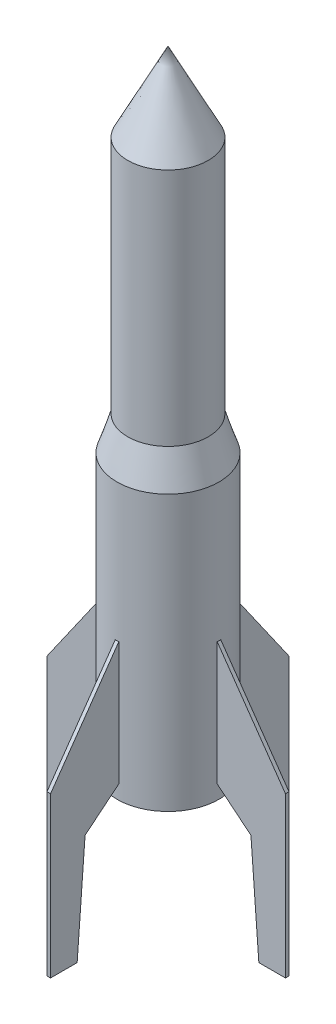
ISO-10303-21;
HEADER;
FILE_DESCRIPTION(('STEP AP214'),'2;1');
FILE_NAME('part.step','',(''),(''),'','','');
FILE_SCHEMA(('AUTOMOTIVE_DESIGN { 1 0 10303 214 1 1 1 1 }'));
ENDSEC;
DATA;
#1=APPLICATION_CONTEXT('core data for automotive mechanical design processes');
#2=APPLICATION_PROTOCOL_DEFINITION('international standard','automotive_design',2000,#1);
#3=PRODUCT_CONTEXT('',#1,'mechanical');
#4=PRODUCT('Part','Part','',(#3));
#5=PRODUCT_RELATED_PRODUCT_CATEGORY('part','',(#4));
#6=PRODUCT_DEFINITION_FORMATION('','',#4);
#7=PRODUCT_DEFINITION_CONTEXT('part definition',#1,'design');
#8=PRODUCT_DEFINITION('design','',#6,#7);
#9=PRODUCT_DEFINITION_SHAPE('','',#8);
#10=(LENGTH_UNIT() NAMED_UNIT(*) SI_UNIT(.MILLI.,.METRE.));
#11=(NAMED_UNIT(*) PLANE_ANGLE_UNIT() SI_UNIT($,.RADIAN.));
#12=(NAMED_UNIT(*) SI_UNIT($,.STERADIAN.) SOLID_ANGLE_UNIT());
#13=UNCERTAINTY_MEASURE_WITH_UNIT(LENGTH_MEASURE(1.E-05),#10,'distance_accuracy_value','');
#14=(GEOMETRIC_REPRESENTATION_CONTEXT(3) GLOBAL_UNCERTAINTY_ASSIGNED_CONTEXT((#13)) GLOBAL_UNIT_ASSIGNED_CONTEXT((#10,
#11,#12)) REPRESENTATION_CONTEXT('',''));
#15=CARTESIAN_POINT('',(0.,0.,0.));
#16=DIRECTION('',(0.,0.,1.));
#17=DIRECTION('',(1.,0.,0.));
#18=AXIS2_PLACEMENT_3D('',#15,#16,#17);
#19=CARTESIAN_POINT('',(-1.99999999999859,-135.,134.5));
#20=DIRECTION('',(0.,1.,0.));
#21=DIRECTION('',(-1.,0.,0.));
#22=AXIS2_PLACEMENT_3D('',#19,#20,#21);
#23=PLANE('',#22);
#24=DIRECTION('',(0.,0.,-1.));
#25=VECTOR('',#24,1.);
#26=CARTESIAN_POINT('',(-1.99999999999859,-135.,134.5));
#27=LINE('',#26,#25);
#28=CARTESIAN_POINT('',(-1.99999999999859,-135.,134.5));
#29=VERTEX_POINT('',#28);
#30=CARTESIAN_POINT('',(-1.99999999999892,-135.,104.5));
#31=VERTEX_POINT('',#30);
#32=EDGE_CURVE('E141',#29,#31,#27,.T.);
#33=ORIENTED_EDGE('',*,*,#32,.T.);
#34=DIRECTION('',(1.,0.,0.));
#35=VECTOR('',#34,1.);
#36=CARTESIAN_POINT('',(-74.9999999999989,-135.,104.500000000001));
#37=LINE('',#36,#35);
#38=CARTESIAN_POINT('',(2.00000000000109,-135.,104.5));
#39=VERTEX_POINT('',#38);
#40=EDGE_CURVE('E95',#31,#39,#37,.T.);
#41=ORIENTED_EDGE('',*,*,#40,.T.);
#42=DIRECTION('',(0.,0.,-1.));
#43=VECTOR('',#42,1.);
#44=CARTESIAN_POINT('',(2.00000000000141,-135.,134.5));
#45=LINE('',#44,#43);
#46=CARTESIAN_POINT('',(2.00000000000141,-135.,134.5));
#47=VERTEX_POINT('',#46);
#48=EDGE_CURVE('E120',#47,#39,#45,.T.);
#49=ORIENTED_EDGE('',*,*,#48,.F.);
#50=DIRECTION('',(1.,0.,0.));
#51=VECTOR('',#50,1.);
#52=CARTESIAN_POINT('',(-1.99999999999859,-135.,134.5));
#53=LINE('',#52,#51);
#54=EDGE_CURVE('E140',#29,#47,#53,.T.);
#55=ORIENTED_EDGE('',*,*,#54,.F.);
#56=EDGE_LOOP('',(#33,#41,#49,#55));
#57=FACE_BOUND('',#56,.T.);
#58=ADVANCED_FACE('F52',(#57),#23,.F.);
#59=CARTESIAN_POINT('',(2.00000000000141,-135.,134.5));
#60=DIRECTION('',(-1.,0.,0.));
#61=DIRECTION('',(0.,-1.,0.));
#62=AXIS2_PLACEMENT_3D('',#59,#60,#61);
#63=PLANE('',#62);
#64=ORIENTED_EDGE('',*,*,#48,.T.);
#65=DIRECTION('',(0.,-0.997211296292099,0.0746299574395645));
#66=VECTOR('',#65,1.);
#67=CARTESIAN_POINT('',(2.00000000000109,-135.,104.5));
#68=LINE('',#67,#66);
#69=CARTESIAN_POINT('',(2.00000000000099,-15.,95.5193607653192));
#70=VERTEX_POINT('',#69);
#71=EDGE_CURVE('E126',#70,#39,#68,.T.);
#72=ORIENTED_EDGE('',*,*,#71,.F.);
#73=DIRECTION('',(0.,-0.633341672383861,0.773872293096228));
#74=VECTOR('',#73,1.);
#75=CARTESIAN_POINT('',(2.00000000000099,-15.,95.5193607653192));
#76=LINE('',#75,#74);
#77=CARTESIAN_POINT('',(2.00000000000059,16.1152702388822,57.5));
#78=VERTEX_POINT('',#77);
#79=EDGE_CURVE('E114',#78,#70,#76,.T.);
#80=ORIENTED_EDGE('',*,*,#79,.F.);
#81=DIRECTION('',(0.,1.,0.));
#82=VECTOR('',#81,1.);
#83=CARTESIAN_POINT('',(2.0000000000006,-135.,57.5));
#84=LINE('',#83,#82);
#85=CARTESIAN_POINT('',(2.00000000000058,155.,57.5));
#86=VERTEX_POINT('',#85);
#87=EDGE_CURVE('E124',#78,#86,#84,.T.);
#88=ORIENTED_EDGE('',*,*,#87,.T.);
#89=DIRECTION('',(0.,0.81923192051904,-0.573462344363328));
#90=VECTOR('',#89,1.);
#91=CARTESIAN_POINT('',(2.0000000000014,45.,134.5));
#92=LINE('',#91,#90);
#93=CARTESIAN_POINT('',(2.0000000000014,45.,134.5));
#94=VERTEX_POINT('',#93);
#95=EDGE_CURVE('E87',#94,#86,#92,.T.);
#96=ORIENTED_EDGE('',*,*,#95,.F.);
#97=DIRECTION('',(0.,1.,0.));
#98=VECTOR('',#97,1.);
#99=CARTESIAN_POINT('',(2.00000000000141,-135.,134.5));
#100=LINE('',#99,#98);
#101=EDGE_CURVE('E146',#47,#94,#100,.T.);
#102=ORIENTED_EDGE('',*,*,#101,.F.);
#103=EDGE_LOOP('',(#64,#72,#80,#88,#96,#102));
#104=FACE_BOUND('',#103,.T.);
#105=ADVANCED_FACE('F123',(#104),#63,.F.);
#106=CARTESIAN_POINT('',(-1.99999999999868,155.,134.5));
#107=DIRECTION('',(1.,0.,0.));
#108=DIRECTION('',(0.,1.,0.));
#109=AXIS2_PLACEMENT_3D('',#106,#107,#108);
#110=PLANE('',#109);
#111=DIRECTION('',(0.,-0.633341672383861,0.773872293096228));
#112=VECTOR('',#111,1.);
#113=CARTESIAN_POINT('',(-1.99999999999968,34.0852764619174,35.5426734428662));
#114=LINE('',#113,#112);
#115=CARTESIAN_POINT('',(-1.99999999999944,16.1152702388822,57.5));
#116=VERTEX_POINT('',#115);
#117=CARTESIAN_POINT('',(-1.99999999999904,-15.,95.5193607653192));
#118=VERTEX_POINT('',#117);
#119=EDGE_CURVE('E66',#116,#118,#114,.T.);
#120=ORIENTED_EDGE('',*,*,#119,.T.);
#121=DIRECTION('',(0.,-0.997211296292099,0.0746299574395645));
#122=VECTOR('',#121,1.);
#123=CARTESIAN_POINT('',(-1.99999999999922,151.152152043229,83.0847563022686));
#124=LINE('',#123,#122);
#125=EDGE_CURVE('E12',#118,#31,#124,.T.);
#126=ORIENTED_EDGE('',*,*,#125,.T.);
#127=ORIENTED_EDGE('',*,*,#32,.F.);
#128=DIRECTION('',(0.,-1.,0.));
#129=VECTOR('',#128,1.);
#130=CARTESIAN_POINT('',(-1.99999999999868,155.,134.5));
#131=LINE('',#130,#129);
#132=CARTESIAN_POINT('',(-1.99999999999868,45.,134.5));
#133=VERTEX_POINT('',#132);
#134=EDGE_CURVE('E75',#133,#29,#131,.T.);
#135=ORIENTED_EDGE('',*,*,#134,.F.);
#136=DIRECTION('',(0.,0.81923192051904,-0.573462344363328));
#137=VECTOR('',#136,1.);
#138=CARTESIAN_POINT('',(-1.99999999999921,118.825503355705,82.8221476510068));
#139=LINE('',#138,#137);
#140=CARTESIAN_POINT('',(-1.99999999999948,155.,57.5));
#141=VERTEX_POINT('',#140);
#142=EDGE_CURVE('E134',#133,#141,#139,.T.);
#143=ORIENTED_EDGE('',*,*,#142,.T.);
#144=DIRECTION('',(0.,-1.,0.));
#145=VECTOR('',#144,1.);
#146=CARTESIAN_POINT('',(-1.99999999999949,155.,57.5));
#147=LINE('',#146,#145);
#148=EDGE_CURVE('E132',#141,#116,#147,.T.);
#149=ORIENTED_EDGE('',*,*,#148,.T.);
#150=EDGE_LOOP('',(#120,#126,#127,#135,#143,#149));
#151=FACE_BOUND('',#150,.T.);
#152=ADVANCED_FACE('F160',(#151),#110,.F.);
#153=CARTESIAN_POINT('',(1.4088127202232E-12,0.,134.5));
#154=DIRECTION('',(0.,0.,1.));
#155=DIRECTION('',(1.,0.,0.));
#156=AXIS2_PLACEMENT_3D('',#153,#154,#155);
#157=PLANE('',#156);
#158=DIRECTION('',(1.,0.,0.));
#159=VECTOR('',#158,1.);
#160=CARTESIAN_POINT('',(-74.9999999999986,45.,134.500000000001));
#161=LINE('',#160,#159);
#162=EDGE_CURVE('E127',#133,#94,#161,.T.);
#163=ORIENTED_EDGE('',*,*,#162,.F.);
#164=ORIENTED_EDGE('',*,*,#134,.T.);
#165=ORIENTED_EDGE('',*,*,#54,.T.);
#166=ORIENTED_EDGE('',*,*,#101,.T.);
#167=EDGE_LOOP('',(#163,#164,#165,#166));
#168=FACE_BOUND('',#167,.T.);
#169=ADVANCED_FACE('F158',(#168),#157,.T.);
#170=CARTESIAN_POINT('',(6.0228053095044E-13,0.,57.5));
#171=DIRECTION('',(0.,0.,1.));
#172=DIRECTION('',(1.,0.,0.));
#173=AXIS2_PLACEMENT_3D('',#170,#171,#172);
#174=PLANE('',#173);
#175=ORIENTED_EDGE('',*,*,#87,.F.);
#176=DIRECTION('',(-1.,0.,0.));
#177=VECTOR('',#176,1.);
#178=CARTESIAN_POINT('',(6.01316546895092E-13,16.1152702388822,57.5));
#179=LINE('',#178,#177);
#180=EDGE_CURVE('E59',#78,#116,#179,.T.);
#181=ORIENTED_EDGE('',*,*,#180,.T.);
#182=ORIENTED_EDGE('',*,*,#148,.F.);
#183=DIRECTION('',(-1.,0.,0.));
#184=VECTOR('',#183,1.);
#185=CARTESIAN_POINT('',(2.00000000000058,155.,57.5));
#186=LINE('',#185,#184);
#187=EDGE_CURVE('E130',#86,#141,#186,.T.);
#188=ORIENTED_EDGE('',*,*,#187,.F.);
#189=EDGE_LOOP('',(#175,#181,#182,#188));
#190=FACE_BOUND('',#189,.T.);
#191=ADVANCED_FACE('F129',(#190),#174,.F.);
#192=CARTESIAN_POINT('',(-74.9999999999986,45.,134.500000000001));
#193=DIRECTION('',(0.,-0.573462344363328,-0.81923192051904));
#194=DIRECTION('',(0.,-0.81923192051904,0.573462344363328));
#195=AXIS2_PLACEMENT_3D('',#192,#193,#194);
#196=PLANE('',#195);
#197=ORIENTED_EDGE('',*,*,#162,.T.);
#198=ORIENTED_EDGE('',*,*,#95,.T.);
#199=ORIENTED_EDGE('',*,*,#187,.T.);
#200=ORIENTED_EDGE('',*,*,#142,.F.);
#201=EDGE_LOOP('',(#197,#198,#199,#200));
#202=FACE_BOUND('',#201,.T.);
#203=ADVANCED_FACE('F163',(#202),#196,.F.);
#204=CARTESIAN_POINT('',(-74.9999999999989,-135.,104.500000000001));
#205=DIRECTION('',(0.,0.0746299574395645,0.997211296292099));
#206=DIRECTION('',(0.,0.997211296292099,-0.0746299574395645));
#207=AXIS2_PLACEMENT_3D('',#204,#205,#206);
#208=PLANE('',#207);
#209=DIRECTION('',(1.,0.,0.));
#210=VECTOR('',#209,1.);
#211=CARTESIAN_POINT('',(-74.999999999999,-15.,95.51936076532));
#212=LINE('',#211,#210);
#213=EDGE_CURVE('E149',#118,#70,#212,.T.);
#214=ORIENTED_EDGE('',*,*,#213,.T.);
#215=ORIENTED_EDGE('',*,*,#71,.T.);
#216=ORIENTED_EDGE('',*,*,#40,.F.);
#217=ORIENTED_EDGE('',*,*,#125,.F.);
#218=EDGE_LOOP('',(#214,#215,#216,#217));
#219=FACE_BOUND('',#218,.T.);
#220=ADVANCED_FACE('F161',(#219),#208,.F.);
#221=CARTESIAN_POINT('',(-74.999999999999,-15.,95.51936076532));
#222=DIRECTION('',(0.,0.773872293096228,0.633341672383861));
#223=DIRECTION('',(0.,0.633341672383861,-0.773872293096228));
#224=AXIS2_PLACEMENT_3D('',#221,#222,#223);
#225=PLANE('',#224);
#226=ORIENTED_EDGE('',*,*,#180,.F.);
#227=ORIENTED_EDGE('',*,*,#79,.T.);
#228=ORIENTED_EDGE('',*,*,#213,.F.);
#229=ORIENTED_EDGE('',*,*,#119,.F.);
#230=EDGE_LOOP('',(#226,#227,#228,#229));
#231=FACE_BOUND('',#230,.T.);
#232=ADVANCED_FACE('F113',(#231),#225,.F.);
#233=CLOSED_SHELL('',(#58,#105,#152,#169,#191,#203,#220,#232));
#234=MANIFOLD_SOLID_BREP('B2',#233);
#235=CARTESIAN_POINT('',(-134.5,-135.,-2.));
#236=DIRECTION('',(0.,1.,0.));
#237=DIRECTION('',(0.,0.,-1.));
#238=AXIS2_PLACEMENT_3D('',#235,#236,#237);
#239=PLANE('',#238);
#240=DIRECTION('',(1.,0.,0.));
#241=VECTOR('',#240,1.);
#242=CARTESIAN_POINT('',(-134.5,-135.,-2.));
#243=LINE('',#242,#241);
#244=CARTESIAN_POINT('',(-134.5,-135.,-2.));
#245=VERTEX_POINT('',#244);
#246=CARTESIAN_POINT('',(-104.5,-135.,-2.00000000000002));
#247=VERTEX_POINT('',#246);
#248=EDGE_CURVE('E339',#245,#247,#243,.T.);
#249=ORIENTED_EDGE('',*,*,#248,.T.);
#250=DIRECTION('',(0.,0.,1.));
#251=VECTOR('',#250,1.);
#252=CARTESIAN_POINT('',(-104.5,-135.,-75.));
#253=LINE('',#252,#251);
#254=CARTESIAN_POINT('',(-104.5,-135.,2.));
#255=VERTEX_POINT('',#254);
#256=EDGE_CURVE('E293',#247,#255,#253,.T.);
#257=ORIENTED_EDGE('',*,*,#256,.T.);
#258=DIRECTION('',(1.,0.,0.));
#259=VECTOR('',#258,1.);
#260=CARTESIAN_POINT('',(-134.5,-135.,2.));
#261=LINE('',#260,#259);
#262=CARTESIAN_POINT('',(-134.5,-135.,2.));
#263=VERTEX_POINT('',#262);
#264=EDGE_CURVE('E318',#263,#255,#261,.T.);
#265=ORIENTED_EDGE('',*,*,#264,.F.);
#266=DIRECTION('',(0.,0.,1.));
#267=VECTOR('',#266,1.);
#268=CARTESIAN_POINT('',(-134.5,-135.,-2.));
#269=LINE('',#268,#267);
#270=EDGE_CURVE('E338',#245,#263,#269,.T.);
#271=ORIENTED_EDGE('',*,*,#270,.F.);
#272=EDGE_LOOP('',(#249,#257,#265,#271));
#273=FACE_BOUND('',#272,.T.);
#274=ADVANCED_FACE('F250',(#273),#239,.F.);
#275=CARTESIAN_POINT('',(-134.5,-135.,2.));
#276=DIRECTION('',(0.,0.,-1.));
#277=DIRECTION('',(0.,-1.,0.));
#278=AXIS2_PLACEMENT_3D('',#275,#276,#277);
#279=PLANE('',#278);
#280=ORIENTED_EDGE('',*,*,#264,.T.);
#281=DIRECTION('',(-0.0746299574395645,-0.997211296292099,0.));
#282=VECTOR('',#281,1.);
#283=CARTESIAN_POINT('',(-104.5,-135.,2.));
#284=LINE('',#283,#282);
#285=CARTESIAN_POINT('',(-95.5193607653192,-15.,1.99999999999999));
#286=VERTEX_POINT('',#285);
#287=EDGE_CURVE('E324',#286,#255,#284,.T.);
#288=ORIENTED_EDGE('',*,*,#287,.F.);
#289=DIRECTION('',(-0.773872293096228,-0.633341672383861,0.));
#290=VECTOR('',#289,1.);
#291=CARTESIAN_POINT('',(-95.5193607653192,-15.,1.99999999999999));
#292=LINE('',#291,#290);
#293=CARTESIAN_POINT('',(-57.5,16.1152702388822,1.99999999999999));
#294=VERTEX_POINT('',#293);
#295=EDGE_CURVE('E312',#294,#286,#292,.T.);
#296=ORIENTED_EDGE('',*,*,#295,.F.);
#297=DIRECTION('',(0.,1.,0.));
#298=VECTOR('',#297,1.);
#299=CARTESIAN_POINT('',(-57.5,-135.,2.));
#300=LINE('',#299,#298);
#301=CARTESIAN_POINT('',(-57.5,155.,1.99999999999998));
#302=VERTEX_POINT('',#301);
#303=EDGE_CURVE('E322',#294,#302,#300,.T.);
#304=ORIENTED_EDGE('',*,*,#303,.T.);
#305=DIRECTION('',(0.573462344363328,0.81923192051904,0.));
#306=VECTOR('',#305,1.);
#307=CARTESIAN_POINT('',(-134.5,45.,1.99999999999999));
#308=LINE('',#307,#306);
#309=CARTESIAN_POINT('',(-134.5,45.,1.99999999999999));
#310=VERTEX_POINT('',#309);
#311=EDGE_CURVE('E285',#310,#302,#308,.T.);
#312=ORIENTED_EDGE('',*,*,#311,.F.);
#313=DIRECTION('',(0.,1.,0.));
#314=VECTOR('',#313,1.);
#315=CARTESIAN_POINT('',(-134.5,-135.,2.));
#316=LINE('',#315,#314);
#317=EDGE_CURVE('E344',#263,#310,#316,.T.);
#318=ORIENTED_EDGE('',*,*,#317,.F.);
#319=EDGE_LOOP('',(#280,#288,#296,#304,#312,#318));
#320=FACE_BOUND('',#319,.T.);
#321=ADVANCED_FACE('F321',(#320),#279,.F.);
#322=CARTESIAN_POINT('',(-134.5,155.,-2.00000000000009));
#323=DIRECTION('',(0.,0.,1.));
#324=DIRECTION('',(0.,1.,0.));
#325=AXIS2_PLACEMENT_3D('',#322,#323,#324);
#326=PLANE('',#325);
#327=DIRECTION('',(-0.773872293096228,-0.633341672383861,0.));
#328=VECTOR('',#327,1.);
#329=CARTESIAN_POINT('',(-35.5426734428661,34.0852764619174,-2.00000000000005));
#330=LINE('',#329,#328);
#331=CARTESIAN_POINT('',(-57.5,16.1152702388822,-2.00000000000005));
#332=VERTEX_POINT('',#331);
#333=CARTESIAN_POINT('',(-95.5193607653192,-15.,-2.00000000000004));
#334=VERTEX_POINT('',#333);
#335=EDGE_CURVE('E264',#332,#334,#330,.T.);
#336=ORIENTED_EDGE('',*,*,#335,.T.);
#337=DIRECTION('',(-0.0746299574395645,-0.997211296292099,0.));
#338=VECTOR('',#337,1.);
#339=CARTESIAN_POINT('',(-83.0847563022686,151.152152043229,-2.00000000000009));
#340=LINE('',#339,#338);
#341=EDGE_CURVE('E50',#334,#247,#340,.T.);
#342=ORIENTED_EDGE('',*,*,#341,.T.);
#343=ORIENTED_EDGE('',*,*,#248,.F.);
#344=DIRECTION('',(0.,-1.,0.));
#345=VECTOR('',#344,1.);
#346=CARTESIAN_POINT('',(-134.5,155.,-2.00000000000009));
#347=LINE('',#346,#345);
#348=CARTESIAN_POINT('',(-134.5,45.,-2.00000000000009));
#349=VERTEX_POINT('',#348);
#350=EDGE_CURVE('E273',#349,#245,#347,.T.);
#351=ORIENTED_EDGE('',*,*,#350,.F.);
#352=DIRECTION('',(0.573462344363328,0.81923192051904,0.));
#353=VECTOR('',#352,1.);
#354=CARTESIAN_POINT('',(-82.8221476510067,118.825503355705,-2.00000000000008));
#355=LINE('',#354,#353);
#356=CARTESIAN_POINT('',(-57.5,155.,-2.00000000000009));
#357=VERTEX_POINT('',#356);
#358=EDGE_CURVE('E332',#349,#357,#355,.T.);
#359=ORIENTED_EDGE('',*,*,#358,.T.);
#360=DIRECTION('',(0.,-1.,0.));
#361=VECTOR('',#360,1.);
#362=CARTESIAN_POINT('',(-57.5,155.,-2.00000000000009));
#363=LINE('',#362,#361);
#364=EDGE_CURVE('E330',#357,#332,#363,.T.);
#365=ORIENTED_EDGE('',*,*,#364,.T.);
#366=EDGE_LOOP('',(#336,#342,#343,#351,#359,#365));
#367=FACE_BOUND('',#366,.T.);
#368=ADVANCED_FACE('F358',(#367),#326,.F.);
#369=CARTESIAN_POINT('',(-134.5,0.,0.));
#370=DIRECTION('',(-1.,0.,0.));
#371=DIRECTION('',(0.,0.,1.));
#372=AXIS2_PLACEMENT_3D('',#369,#370,#371);
#373=PLANE('',#372);
#374=DIRECTION('',(0.,0.,1.));
#375=VECTOR('',#374,1.);
#376=CARTESIAN_POINT('',(-134.5,45.,-75.));
#377=LINE('',#376,#375);
#378=EDGE_CURVE('E325',#349,#310,#377,.T.);
#379=ORIENTED_EDGE('',*,*,#378,.F.);
#380=ORIENTED_EDGE('',*,*,#350,.T.);
#381=ORIENTED_EDGE('',*,*,#270,.T.);
#382=ORIENTED_EDGE('',*,*,#317,.T.);
#383=EDGE_LOOP('',(#379,#380,#381,#382));
#384=FACE_BOUND('',#383,.T.);
#385=ADVANCED_FACE('F356',(#384),#373,.T.);
#386=CARTESIAN_POINT('',(-57.5,0.,0.));
#387=DIRECTION('',(-1.,0.,0.));
#388=DIRECTION('',(0.,0.,1.));
#389=AXIS2_PLACEMENT_3D('',#386,#387,#388);
#390=PLANE('',#389);
#391=ORIENTED_EDGE('',*,*,#303,.F.);
#392=DIRECTION('',(0.,0.,-1.));
#393=VECTOR('',#392,1.);
#394=CARTESIAN_POINT('',(-57.5,16.1152702388822,0.));
#395=LINE('',#394,#393);
#396=EDGE_CURVE('E257',#294,#332,#395,.T.);
#397=ORIENTED_EDGE('',*,*,#396,.T.);
#398=ORIENTED_EDGE('',*,*,#364,.F.);
#399=DIRECTION('',(0.,0.,-1.));
#400=VECTOR('',#399,1.);
#401=CARTESIAN_POINT('',(-57.5,155.,1.99999999999998));
#402=LINE('',#401,#400);
#403=EDGE_CURVE('E328',#302,#357,#402,.T.);
#404=ORIENTED_EDGE('',*,*,#403,.F.);
#405=EDGE_LOOP('',(#391,#397,#398,#404));
#406=FACE_BOUND('',#405,.T.);
#407=ADVANCED_FACE('F327',(#406),#390,.F.);
#408=CARTESIAN_POINT('',(-134.5,45.,-75.));
#409=DIRECTION('',(0.81923192051904,-0.573462344363328,0.));
#410=DIRECTION('',(-0.573462344363328,-0.81923192051904,0.));
#411=AXIS2_PLACEMENT_3D('',#408,#409,#410);
#412=PLANE('',#411);
#413=ORIENTED_EDGE('',*,*,#378,.T.);
#414=ORIENTED_EDGE('',*,*,#311,.T.);
#415=ORIENTED_EDGE('',*,*,#403,.T.);
#416=ORIENTED_EDGE('',*,*,#358,.F.);
#417=EDGE_LOOP('',(#413,#414,#415,#416));
#418=FACE_BOUND('',#417,.T.);
#419=ADVANCED_FACE('F361',(#418),#412,.F.);
#420=CARTESIAN_POINT('',(-104.5,-135.,-75.));
#421=DIRECTION('',(-0.997211296292099,0.0746299574395645,0.));
#422=DIRECTION('',(0.0746299574395645,0.997211296292099,0.));
#423=AXIS2_PLACEMENT_3D('',#420,#421,#422);
#424=PLANE('',#423);
#425=DIRECTION('',(0.,0.,1.));
#426=VECTOR('',#425,1.);
#427=CARTESIAN_POINT('',(-95.5193607653192,-15.,-75.));
#428=LINE('',#427,#426);
#429=EDGE_CURVE('E347',#334,#286,#428,.T.);
#430=ORIENTED_EDGE('',*,*,#429,.T.);
#431=ORIENTED_EDGE('',*,*,#287,.T.);
#432=ORIENTED_EDGE('',*,*,#256,.F.);
#433=ORIENTED_EDGE('',*,*,#341,.F.);
#434=EDGE_LOOP('',(#430,#431,#432,#433));
#435=FACE_BOUND('',#434,.T.);
#436=ADVANCED_FACE('F359',(#435),#424,.F.);
#437=CARTESIAN_POINT('',(-95.5193607653192,-15.,-75.));
#438=DIRECTION('',(-0.633341672383861,0.773872293096228,0.));
#439=DIRECTION('',(0.773872293096228,0.633341672383861,0.));
#440=AXIS2_PLACEMENT_3D('',#437,#438,#439);
#441=PLANE('',#440);
#442=ORIENTED_EDGE('',*,*,#396,.F.);
#443=ORIENTED_EDGE('',*,*,#295,.T.);
#444=ORIENTED_EDGE('',*,*,#429,.F.);
#445=ORIENTED_EDGE('',*,*,#335,.F.);
#446=EDGE_LOOP('',(#442,#443,#444,#445));
#447=FACE_BOUND('',#446,.T.);
#448=ADVANCED_FACE('F311',(#447),#441,.F.);
#449=CLOSED_SHELL('',(#274,#321,#368,#385,#407,#419,#436,#448));
#450=MANIFOLD_SOLID_BREP('B6',#449);
#451=CARTESIAN_POINT('',(1.99999999999953,-135.,-134.5));
#452=DIRECTION('',(0.,1.,0.));
#453=DIRECTION('',(1.,0.,0.));
#454=AXIS2_PLACEMENT_3D('',#451,#452,#453);
#455=PLANE('',#454);
#456=DIRECTION('',(0.,0.,1.));
#457=VECTOR('',#456,1.);
#458=CARTESIAN_POINT('',(1.99999999999953,-135.,-134.5));
#459=LINE('',#458,#457);
#460=CARTESIAN_POINT('',(1.99999999999953,-135.,-134.5));
#461=VERTEX_POINT('',#460);
#462=CARTESIAN_POINT('',(1.99999999999965,-135.,-104.5));
#463=VERTEX_POINT('',#462);
#464=EDGE_CURVE('E537',#461,#463,#459,.T.);
#465=ORIENTED_EDGE('',*,*,#464,.T.);
#466=DIRECTION('',(-1.,0.,0.));
#467=VECTOR('',#466,1.);
#468=CARTESIAN_POINT('',(74.9999999999996,-135.,-104.5));
#469=LINE('',#468,#467);
#470=CARTESIAN_POINT('',(-2.00000000000036,-135.,-104.5));
#471=VERTEX_POINT('',#470);
#472=EDGE_CURVE('E491',#463,#471,#469,.T.);
#473=ORIENTED_EDGE('',*,*,#472,.T.);
#474=DIRECTION('',(0.,0.,1.));
#475=VECTOR('',#474,1.);
#476=CARTESIAN_POINT('',(-2.00000000000047,-135.,-134.5));
#477=LINE('',#476,#475);
#478=CARTESIAN_POINT('',(-2.00000000000047,-135.,-134.5));
#479=VERTEX_POINT('',#478);
#480=EDGE_CURVE('E516',#479,#471,#477,.T.);
#481=ORIENTED_EDGE('',*,*,#480,.F.);
#482=DIRECTION('',(-1.,0.,0.));
#483=VECTOR('',#482,1.);
#484=CARTESIAN_POINT('',(1.99999999999953,-135.,-134.5));
#485=LINE('',#484,#483);
#486=EDGE_CURVE('E536',#461,#479,#485,.T.);
#487=ORIENTED_EDGE('',*,*,#486,.F.);
#488=EDGE_LOOP('',(#465,#473,#481,#487));
#489=FACE_BOUND('',#488,.T.);
#490=ADVANCED_FACE('F448',(#489),#455,.F.);
#491=CARTESIAN_POINT('',(-2.00000000000047,-135.,-134.5));
#492=DIRECTION('',(1.,0.,0.));
#493=DIRECTION('',(0.,-1.,0.));
#494=AXIS2_PLACEMENT_3D('',#491,#492,#493);
#495=PLANE('',#494);
#496=ORIENTED_EDGE('',*,*,#480,.T.);
#497=DIRECTION('',(0.,-0.997211296292099,-0.0746299574395645));
#498=VECTOR('',#497,1.);
#499=CARTESIAN_POINT('',(-2.00000000000036,-135.,-104.5));
#500=LINE('',#499,#498);
#501=CARTESIAN_POINT('',(-2.00000000000033,-15.,-95.5193607653192));
#502=VERTEX_POINT('',#501);
#503=EDGE_CURVE('E522',#502,#471,#500,.T.);
#504=ORIENTED_EDGE('',*,*,#503,.F.);
#505=DIRECTION('',(0.,-0.633341672383861,-0.773872293096228));
#506=VECTOR('',#505,1.);
#507=CARTESIAN_POINT('',(-2.00000000000033,-15.,-95.5193607653192));
#508=LINE('',#507,#506);
#509=CARTESIAN_POINT('',(-2.00000000000019,16.1152702388822,-57.5));
#510=VERTEX_POINT('',#509);
#511=EDGE_CURVE('E510',#510,#502,#508,.T.);
#512=ORIENTED_EDGE('',*,*,#511,.F.);
#513=DIRECTION('',(0.,1.,0.));
#514=VECTOR('',#513,1.);
#515=CARTESIAN_POINT('',(-2.0000000000002,-135.,-57.5));
#516=LINE('',#515,#514);
#517=CARTESIAN_POINT('',(-2.00000000000018,155.,-57.5));
#518=VERTEX_POINT('',#517);
#519=EDGE_CURVE('E520',#510,#518,#516,.T.);
#520=ORIENTED_EDGE('',*,*,#519,.T.);
#521=DIRECTION('',(0.,0.81923192051904,0.573462344363328));
#522=VECTOR('',#521,1.);
#523=CARTESIAN_POINT('',(-2.00000000000046,45.,-134.5));
#524=LINE('',#523,#522);
#525=CARTESIAN_POINT('',(-2.00000000000046,45.,-134.5));
#526=VERTEX_POINT('',#525);
#527=EDGE_CURVE('E483',#526,#518,#524,.T.);
#528=ORIENTED_EDGE('',*,*,#527,.F.);
#529=DIRECTION('',(0.,1.,0.));
#530=VECTOR('',#529,1.);
#531=CARTESIAN_POINT('',(-2.00000000000047,-135.,-134.5));
#532=LINE('',#531,#530);
#533=EDGE_CURVE('E542',#479,#526,#532,.T.);
#534=ORIENTED_EDGE('',*,*,#533,.F.);
#535=EDGE_LOOP('',(#496,#504,#512,#520,#528,#534));
#536=FACE_BOUND('',#535,.T.);
#537=ADVANCED_FACE('F519',(#536),#495,.F.);
#538=CARTESIAN_POINT('',(1.99999999999962,155.,-134.5));
#539=DIRECTION('',(-1.,0.,0.));
#540=DIRECTION('',(0.,1.,0.));
#541=AXIS2_PLACEMENT_3D('',#538,#539,#540);
#542=PLANE('',#541);
#543=DIRECTION('',(0.,-0.633341672383861,-0.773872293096228));
#544=VECTOR('',#543,1.);
#545=CARTESIAN_POINT('',(1.99999999999993,34.0852764619174,-35.5426734428662));
#546=LINE('',#545,#544);
#547=CARTESIAN_POINT('',(1.99999999999985,16.1152702388822,-57.5));
#548=VERTEX_POINT('',#547);
#549=CARTESIAN_POINT('',(1.99999999999971,-15.,-95.5193607653192));
#550=VERTEX_POINT('',#549);
#551=EDGE_CURVE('E462',#548,#550,#546,.T.);
#552=ORIENTED_EDGE('',*,*,#551,.T.);
#553=DIRECTION('',(0.,-0.997211296292099,-0.0746299574395645));
#554=VECTOR('',#553,1.);
#555=CARTESIAN_POINT('',(1.9999999999998,151.152152043229,-83.0847563022686));
#556=LINE('',#555,#554);
#557=EDGE_CURVE('E248',#550,#463,#556,.T.);
#558=ORIENTED_EDGE('',*,*,#557,.T.);
#559=ORIENTED_EDGE('',*,*,#464,.F.);
#560=DIRECTION('',(0.,-1.,0.));
#561=VECTOR('',#560,1.);
#562=CARTESIAN_POINT('',(1.99999999999962,155.,-134.5));
#563=LINE('',#562,#561);
#564=CARTESIAN_POINT('',(1.99999999999962,45.,-134.5));
#565=VERTEX_POINT('',#564);
#566=EDGE_CURVE('E471',#565,#461,#563,.T.);
#567=ORIENTED_EDGE('',*,*,#566,.F.);
#568=DIRECTION('',(0.,0.81923192051904,0.573462344363328));
#569=VECTOR('',#568,1.);
#570=CARTESIAN_POINT('',(1.99999999999979,118.825503355705,-82.8221476510067));
#571=LINE('',#570,#569);
#572=CARTESIAN_POINT('',(1.99999999999988,155.,-57.5));
#573=VERTEX_POINT('',#572);
#574=EDGE_CURVE('E530',#565,#573,#571,.T.);
#575=ORIENTED_EDGE('',*,*,#574,.T.);
#576=DIRECTION('',(0.,-1.,0.));
#577=VECTOR('',#576,1.);
#578=CARTESIAN_POINT('',(1.99999999999989,155.,-57.5));
#579=LINE('',#578,#577);
#580=EDGE_CURVE('E528',#573,#548,#579,.T.);
#581=ORIENTED_EDGE('',*,*,#580,.T.);
#582=EDGE_LOOP('',(#552,#558,#559,#567,#575,#581));
#583=FACE_BOUND('',#582,.T.);
#584=ADVANCED_FACE('F556',(#583),#542,.F.);
#585=CARTESIAN_POINT('',(-4.69604240074401E-13,0.,-134.5));
#586=DIRECTION('',(0.,0.,-1.));
#587=DIRECTION('',(-1.,0.,0.));
#588=AXIS2_PLACEMENT_3D('',#585,#586,#587);
#589=PLANE('',#588);
#590=DIRECTION('',(-1.,0.,0.));
#591=VECTOR('',#590,1.);
#592=CARTESIAN_POINT('',(74.9999999999995,45.,-134.5));
#593=LINE('',#592,#591);
#594=EDGE_CURVE('E523',#565,#526,#593,.T.);
#595=ORIENTED_EDGE('',*,*,#594,.F.);
#596=ORIENTED_EDGE('',*,*,#566,.T.);
#597=ORIENTED_EDGE('',*,*,#486,.T.);
#598=ORIENTED_EDGE('',*,*,#533,.T.);
#599=EDGE_LOOP('',(#595,#596,#597,#598));
#600=FACE_BOUND('',#599,.T.);
#601=ADVANCED_FACE('F554',(#600),#589,.T.);
#602=CARTESIAN_POINT('',(-2.0076017698348E-13,0.,-57.5));
#603=DIRECTION('',(0.,0.,-1.));
#604=DIRECTION('',(-1.,0.,0.));
#605=AXIS2_PLACEMENT_3D('',#602,#603,#604);
#606=PLANE('',#605);
#607=ORIENTED_EDGE('',*,*,#519,.F.);
#608=DIRECTION('',(1.,0.,0.));
#609=VECTOR('',#608,1.);
#610=CARTESIAN_POINT('',(-1.99796192928132E-13,16.1152702388822,-57.5));
#611=LINE('',#610,#609);
#612=EDGE_CURVE('E455',#510,#548,#611,.T.);
#613=ORIENTED_EDGE('',*,*,#612,.T.);
#614=ORIENTED_EDGE('',*,*,#580,.F.);
#615=DIRECTION('',(1.,0.,0.));
#616=VECTOR('',#615,1.);
#617=CARTESIAN_POINT('',(-2.00000000000018,155.,-57.5));
#618=LINE('',#617,#616);
#619=EDGE_CURVE('E526',#518,#573,#618,.T.);
#620=ORIENTED_EDGE('',*,*,#619,.F.);
#621=EDGE_LOOP('',(#607,#613,#614,#620));
#622=FACE_BOUND('',#621,.T.);
#623=ADVANCED_FACE('F525',(#622),#606,.F.);
#624=CARTESIAN_POINT('',(74.9999999999995,45.,-134.5));
#625=DIRECTION('',(0.,-0.573462344363328,0.81923192051904));
#626=DIRECTION('',(0.,-0.81923192051904,-0.573462344363328));
#627=AXIS2_PLACEMENT_3D('',#624,#625,#626);
#628=PLANE('',#627);
#629=ORIENTED_EDGE('',*,*,#594,.T.);
#630=ORIENTED_EDGE('',*,*,#527,.T.);
#631=ORIENTED_EDGE('',*,*,#619,.T.);
#632=ORIENTED_EDGE('',*,*,#574,.F.);
#633=EDGE_LOOP('',(#629,#630,#631,#632));
#634=FACE_BOUND('',#633,.T.);
#635=ADVANCED_FACE('F559',(#634),#628,.F.);
#636=CARTESIAN_POINT('',(74.9999999999996,-135.,-104.5));
#637=DIRECTION('',(0.,0.0746299574395645,-0.997211296292099));
#638=DIRECTION('',(0.,0.997211296292099,0.0746299574395645));
#639=AXIS2_PLACEMENT_3D('',#636,#637,#638);
#640=PLANE('',#639);
#641=DIRECTION('',(-1.,0.,0.));
#642=VECTOR('',#641,1.);
#643=CARTESIAN_POINT('',(74.9999999999997,-15.,-95.5193607653195));
#644=LINE('',#643,#642);
#645=EDGE_CURVE('E545',#550,#502,#644,.T.);
#646=ORIENTED_EDGE('',*,*,#645,.T.);
#647=ORIENTED_EDGE('',*,*,#503,.T.);
#648=ORIENTED_EDGE('',*,*,#472,.F.);
#649=ORIENTED_EDGE('',*,*,#557,.F.);
#650=EDGE_LOOP('',(#646,#647,#648,#649));
#651=FACE_BOUND('',#650,.T.);
#652=ADVANCED_FACE('F557',(#651),#640,.F.);
#653=CARTESIAN_POINT('',(74.9999999999997,-15.,-95.5193607653195));
#654=DIRECTION('',(0.,0.773872293096228,-0.633341672383861));
#655=DIRECTION('',(0.,0.633341672383861,0.773872293096228));
#656=AXIS2_PLACEMENT_3D('',#653,#654,#655);
#657=PLANE('',#656);
#658=ORIENTED_EDGE('',*,*,#612,.F.);
#659=ORIENTED_EDGE('',*,*,#511,.T.);
#660=ORIENTED_EDGE('',*,*,#645,.F.);
#661=ORIENTED_EDGE('',*,*,#551,.F.);
#662=EDGE_LOOP('',(#658,#659,#660,#661));
#663=FACE_BOUND('',#662,.T.);
#664=ADVANCED_FACE('F509',(#663),#657,.F.);
#665=CLOSED_SHELL('',(#490,#537,#584,#601,#623,#635,#652,#664));
#666=MANIFOLD_SOLID_BREP('B44',#665);
#667=CARTESIAN_POINT('',(134.5,-135.,2.));
#668=DIRECTION('',(0.,1.,0.));
#669=DIRECTION('',(0.,0.,1.));
#670=AXIS2_PLACEMENT_3D('',#667,#668,#669);
#671=PLANE('',#670);
#672=DIRECTION('',(-1.,0.,0.));
#673=VECTOR('',#672,1.);
#674=CARTESIAN_POINT('',(134.5,-135.,2.));
#675=LINE('',#674,#673);
#676=CARTESIAN_POINT('',(134.5,-135.,2.));
#677=VERTEX_POINT('',#676);
#678=CARTESIAN_POINT('',(104.5,-135.,2.00000000000002));
#679=VERTEX_POINT('',#678);
#680=EDGE_CURVE('E736',#677,#679,#675,.T.);
#681=ORIENTED_EDGE('',*,*,#680,.T.);
#682=DIRECTION('',(0.,0.,-1.));
#683=VECTOR('',#682,1.);
#684=CARTESIAN_POINT('',(104.5,-135.,75.));
#685=LINE('',#684,#683);
#686=CARTESIAN_POINT('',(104.5,-135.,-2.));
#687=VERTEX_POINT('',#686);
#688=EDGE_CURVE('E690',#679,#687,#685,.T.);
#689=ORIENTED_EDGE('',*,*,#688,.T.);
#690=DIRECTION('',(-1.,0.,0.));
#691=VECTOR('',#690,1.);
#692=CARTESIAN_POINT('',(134.5,-135.,-2.));
#693=LINE('',#692,#691);
#694=CARTESIAN_POINT('',(134.5,-135.,-2.));
#695=VERTEX_POINT('',#694);
#696=EDGE_CURVE('E715',#695,#687,#693,.T.);
#697=ORIENTED_EDGE('',*,*,#696,.F.);
#698=DIRECTION('',(0.,0.,-1.));
#699=VECTOR('',#698,1.);
#700=CARTESIAN_POINT('',(134.5,-135.,2.));
#701=LINE('',#700,#699);
#702=EDGE_CURVE('E735',#677,#695,#701,.T.);
#703=ORIENTED_EDGE('',*,*,#702,.F.);
#704=EDGE_LOOP('',(#681,#689,#697,#703));
#705=FACE_BOUND('',#704,.T.);
#706=ADVANCED_FACE('F647',(#705),#671,.F.);
#707=CARTESIAN_POINT('',(134.5,-135.,-2.));
#708=DIRECTION('',(0.,0.,1.));
#709=DIRECTION('',(0.,-1.,0.));
#710=AXIS2_PLACEMENT_3D('',#707,#708,#709);
#711=PLANE('',#710);
#712=ORIENTED_EDGE('',*,*,#696,.T.);
#713=DIRECTION('',(0.0746299574395645,-0.997211296292099,0.));
#714=VECTOR('',#713,1.);
#715=CARTESIAN_POINT('',(104.5,-135.,-2.));
#716=LINE('',#715,#714);
#717=CARTESIAN_POINT('',(95.5193607653192,-15.,-1.99999999999999));
#718=VERTEX_POINT('',#717);
#719=EDGE_CURVE('E721',#718,#687,#716,.T.);
#720=ORIENTED_EDGE('',*,*,#719,.F.);
#721=DIRECTION('',(0.773872293096228,-0.633341672383861,0.));
#722=VECTOR('',#721,1.);
#723=CARTESIAN_POINT('',(95.5193607653192,-15.,-1.99999999999999));
#724=LINE('',#723,#722);
#725=CARTESIAN_POINT('',(57.5,16.1152702388822,-1.99999999999999));
#726=VERTEX_POINT('',#725);
#727=EDGE_CURVE('E709',#726,#718,#724,.T.);
#728=ORIENTED_EDGE('',*,*,#727,.F.);
#729=DIRECTION('',(0.,1.,0.));
#730=VECTOR('',#729,1.);
#731=CARTESIAN_POINT('',(57.5,-135.,-2.));
#732=LINE('',#731,#730);
#733=CARTESIAN_POINT('',(57.5,155.,-1.99999999999998));
#734=VERTEX_POINT('',#733);
#735=EDGE_CURVE('E719',#726,#734,#732,.T.);
#736=ORIENTED_EDGE('',*,*,#735,.T.);
#737=DIRECTION('',(-0.573462344363328,0.81923192051904,0.));
#738=VECTOR('',#737,1.);
#739=CARTESIAN_POINT('',(134.5,45.,-1.99999999999999));
#740=LINE('',#739,#738);
#741=CARTESIAN_POINT('',(134.5,45.,-1.99999999999999));
#742=VERTEX_POINT('',#741);
#743=EDGE_CURVE('E682',#742,#734,#740,.T.);
#744=ORIENTED_EDGE('',*,*,#743,.F.);
#745=DIRECTION('',(0.,1.,0.));
#746=VECTOR('',#745,1.);
#747=CARTESIAN_POINT('',(134.5,-135.,-2.));
#748=LINE('',#747,#746);
#749=EDGE_CURVE('E741',#695,#742,#748,.T.);
#750=ORIENTED_EDGE('',*,*,#749,.F.);
#751=EDGE_LOOP('',(#712,#720,#728,#736,#744,#750));
#752=FACE_BOUND('',#751,.T.);
#753=ADVANCED_FACE('F718',(#752),#711,.F.);
#754=CARTESIAN_POINT('',(134.5,155.,2.00000000000009));
#755=DIRECTION('',(0.,0.,-1.));
#756=DIRECTION('',(0.,1.,0.));
#757=AXIS2_PLACEMENT_3D('',#754,#755,#756);
#758=PLANE('',#757);
#759=DIRECTION('',(0.773872293096228,-0.633341672383861,0.));
#760=VECTOR('',#759,1.);
#761=CARTESIAN_POINT('',(35.5426734428661,34.0852764619174,2.00000000000005));
#762=LINE('',#761,#760);
#763=CARTESIAN_POINT('',(57.5,16.1152702388822,2.00000000000005));
#764=VERTEX_POINT('',#763);
#765=CARTESIAN_POINT('',(95.5193607653192,-15.,2.00000000000004));
#766=VERTEX_POINT('',#765);
#767=EDGE_CURVE('E661',#764,#766,#762,.T.);
#768=ORIENTED_EDGE('',*,*,#767,.T.);
#769=DIRECTION('',(0.0746299574395645,-0.997211296292099,0.));
#770=VECTOR('',#769,1.);
#771=CARTESIAN_POINT('',(83.0847563022686,151.152152043229,2.00000000000009));
#772=LINE('',#771,#770);
#773=EDGE_CURVE('E446',#766,#679,#772,.T.);
#774=ORIENTED_EDGE('',*,*,#773,.T.);
#775=ORIENTED_EDGE('',*,*,#680,.F.);
#776=DIRECTION('',(0.,-1.,0.));
#777=VECTOR('',#776,1.);
#778=CARTESIAN_POINT('',(134.5,155.,2.00000000000009));
#779=LINE('',#778,#777);
#780=CARTESIAN_POINT('',(134.5,45.,2.00000000000009));
#781=VERTEX_POINT('',#780);
#782=EDGE_CURVE('E670',#781,#677,#779,.T.);
#783=ORIENTED_EDGE('',*,*,#782,.F.);
#784=DIRECTION('',(-0.573462344363328,0.81923192051904,0.));
#785=VECTOR('',#784,1.);
#786=CARTESIAN_POINT('',(82.8221476510067,118.825503355705,2.00000000000008));
#787=LINE('',#786,#785);
#788=CARTESIAN_POINT('',(57.5,155.,2.00000000000009));
#789=VERTEX_POINT('',#788);
#790=EDGE_CURVE('E729',#781,#789,#787,.T.);
#791=ORIENTED_EDGE('',*,*,#790,.T.);
#792=DIRECTION('',(0.,-1.,0.));
#793=VECTOR('',#792,1.);
#794=CARTESIAN_POINT('',(57.5,155.,2.00000000000009));
#795=LINE('',#794,#793);
#796=EDGE_CURVE('E727',#789,#764,#795,.T.);
#797=ORIENTED_EDGE('',*,*,#796,.T.);
#798=EDGE_LOOP('',(#768,#774,#775,#783,#791,#797));
#799=FACE_BOUND('',#798,.T.);
#800=ADVANCED_FACE('F755',(#799),#758,.F.);
#801=CARTESIAN_POINT('',(134.5,0.,0.));
#802=DIRECTION('',(1.,0.,0.));
#803=DIRECTION('',(0.,0.,-1.));
#804=AXIS2_PLACEMENT_3D('',#801,#802,#803);
#805=PLANE('',#804);
#806=DIRECTION('',(0.,0.,-1.));
#807=VECTOR('',#806,1.);
#808=CARTESIAN_POINT('',(134.5,45.,75.));
#809=LINE('',#808,#807);
#810=EDGE_CURVE('E722',#781,#742,#809,.T.);
#811=ORIENTED_EDGE('',*,*,#810,.F.);
#812=ORIENTED_EDGE('',*,*,#782,.T.);
#813=ORIENTED_EDGE('',*,*,#702,.T.);
#814=ORIENTED_EDGE('',*,*,#749,.T.);
#815=EDGE_LOOP('',(#811,#812,#813,#814));
#816=FACE_BOUND('',#815,.T.);
#817=ADVANCED_FACE('F753',(#816),#805,.T.);
#818=CARTESIAN_POINT('',(57.5,0.,0.));
#819=DIRECTION('',(1.,0.,0.));
#820=DIRECTION('',(0.,0.,-1.));
#821=AXIS2_PLACEMENT_3D('',#818,#819,#820);
#822=PLANE('',#821);
#823=ORIENTED_EDGE('',*,*,#735,.F.);
#824=DIRECTION('',(0.,0.,1.));
#825=VECTOR('',#824,1.);
#826=CARTESIAN_POINT('',(57.5,16.1152702388822,0.));
#827=LINE('',#826,#825);
#828=EDGE_CURVE('E654',#726,#764,#827,.T.);
#829=ORIENTED_EDGE('',*,*,#828,.T.);
#830=ORIENTED_EDGE('',*,*,#796,.F.);
#831=DIRECTION('',(0.,0.,1.));
#832=VECTOR('',#831,1.);
#833=CARTESIAN_POINT('',(57.5,155.,-1.99999999999998));
#834=LINE('',#833,#832);
#835=EDGE_CURVE('E725',#734,#789,#834,.T.);
#836=ORIENTED_EDGE('',*,*,#835,.F.);
#837=EDGE_LOOP('',(#823,#829,#830,#836));
#838=FACE_BOUND('',#837,.T.);
#839=ADVANCED_FACE('F724',(#838),#822,.F.);
#840=CARTESIAN_POINT('',(134.5,45.,75.));
#841=DIRECTION('',(-0.81923192051904,-0.573462344363328,0.));
#842=DIRECTION('',(0.573462344363328,-0.81923192051904,0.));
#843=AXIS2_PLACEMENT_3D('',#840,#841,#842);
#844=PLANE('',#843);
#845=ORIENTED_EDGE('',*,*,#810,.T.);
#846=ORIENTED_EDGE('',*,*,#743,.T.);
#847=ORIENTED_EDGE('',*,*,#835,.T.);
#848=ORIENTED_EDGE('',*,*,#790,.F.);
#849=EDGE_LOOP('',(#845,#846,#847,#848));
#850=FACE_BOUND('',#849,.T.);
#851=ADVANCED_FACE('F758',(#850),#844,.F.);
#852=CARTESIAN_POINT('',(104.5,-135.,75.));
#853=DIRECTION('',(0.997211296292099,0.0746299574395645,0.));
#854=DIRECTION('',(-0.0746299574395645,0.997211296292099,0.));
#855=AXIS2_PLACEMENT_3D('',#852,#853,#854);
#856=PLANE('',#855);
#857=DIRECTION('',(0.,0.,-1.));
#858=VECTOR('',#857,1.);
#859=CARTESIAN_POINT('',(95.5193607653192,-15.,75.));
#860=LINE('',#859,#858);
#861=EDGE_CURVE('E744',#766,#718,#860,.T.);
#862=ORIENTED_EDGE('',*,*,#861,.T.);
#863=ORIENTED_EDGE('',*,*,#719,.T.);
#864=ORIENTED_EDGE('',*,*,#688,.F.);
#865=ORIENTED_EDGE('',*,*,#773,.F.);
#866=EDGE_LOOP('',(#862,#863,#864,#865));
#867=FACE_BOUND('',#866,.T.);
#868=ADVANCED_FACE('F756',(#867),#856,.F.);
#869=CARTESIAN_POINT('',(95.5193607653192,-15.,75.));
#870=DIRECTION('',(0.633341672383861,0.773872293096228,0.));
#871=DIRECTION('',(-0.773872293096228,0.633341672383861,0.));
#872=AXIS2_PLACEMENT_3D('',#869,#870,#871);
#873=PLANE('',#872);
#874=ORIENTED_EDGE('',*,*,#828,.F.);
#875=ORIENTED_EDGE('',*,*,#727,.T.);
#876=ORIENTED_EDGE('',*,*,#861,.F.);
#877=ORIENTED_EDGE('',*,*,#767,.F.);
#878=EDGE_LOOP('',(#874,#875,#876,#877));
#879=FACE_BOUND('',#878,.T.);
#880=ADVANCED_FACE('F708',(#879),#873,.F.);
#881=CLOSED_SHELL('',(#706,#753,#800,#817,#839,#851,#868,#880));
#882=MANIFOLD_SOLID_BREP('B242',#881);
#883=CARTESIAN_POINT('',(0.,310.,0.));
#884=DIRECTION('',(0.,-1.,0.));
#885=DIRECTION('',(0.,0.,-1.));
#886=AXIS2_PLACEMENT_3D('',#883,#884,#885);
#887=CYLINDRICAL_SURFACE('',#886,57.5);
#888=CARTESIAN_POINT('',(0.,310.,0.));
#889=DIRECTION('',(0.,1.,0.));
#890=DIRECTION('',(0.,0.,1.));
#891=AXIS2_PLACEMENT_3D('',#888,#889,#890);
#892=CIRCLE('',#891,57.5);
#893=CARTESIAN_POINT('',(0.,310.,57.5));
#894=VERTEX_POINT('',#893);
#895=EDGE_CURVE('E842',#894,#894,#892,.T.);
#896=ORIENTED_EDGE('',*,*,#895,.F.);
#897=EDGE_LOOP('',(#896));
#898=FACE_BOUND('',#897,.T.);
#899=CARTESIAN_POINT('',(0.,0.,0.));
#900=DIRECTION('',(0.,1.,0.));
#901=DIRECTION('',(0.,0.,1.));
#902=AXIS2_PLACEMENT_3D('',#899,#900,#901);
#903=CIRCLE('',#902,57.5);
#904=CARTESIAN_POINT('',(0.,0.,57.5));
#905=VERTEX_POINT('',#904);
#906=EDGE_CURVE('E872',#905,#905,#903,.T.);
#907=ORIENTED_EDGE('',*,*,#906,.T.);
#908=EDGE_LOOP('',(#907));
#909=FACE_BOUND('',#908,.T.);
#910=ADVANCED_FACE('F835',(#898,#909),#887,.T.);
#911=CARTESIAN_POINT('',(0.,0.,0.));
#912=DIRECTION('',(0.,1.,0.));
#913=DIRECTION('',(0.,0.,1.));
#914=AXIS2_PLACEMENT_3D('',#911,#912,#913);
#915=PLANE('',#914);
#916=CARTESIAN_POINT('',(0.,0.,0.));
#917=DIRECTION('',(0.,-1.,0.));
#918=DIRECTION('',(0.,0.,-1.));
#919=AXIS2_PLACEMENT_3D('',#916,#917,#918);
#920=CIRCLE('',#919,53.5);
#921=CARTESIAN_POINT('',(0.,0.,-53.5));
#922=VERTEX_POINT('',#921);
#923=EDGE_CURVE('E877',#922,#922,#920,.T.);
#924=ORIENTED_EDGE('',*,*,#923,.F.);
#925=EDGE_LOOP('',(#924));
#926=FACE_BOUND('',#925,.T.);
#927=ORIENTED_EDGE('',*,*,#906,.F.);
#928=EDGE_LOOP('',(#927));
#929=FACE_BOUND('',#928,.T.);
#930=ADVANCED_FACE('F860',(#926,#929),#915,.F.);
#931=CARTESIAN_POINT('',(0.,310.,0.));
#932=DIRECTION('',(0.,-1.,0.));
#933=DIRECTION('',(0.,0.,-1.));
#934=AXIS2_PLACEMENT_3D('',#931,#932,#933);
#935=CYLINDRICAL_SURFACE('',#934,53.5);
#936=CARTESIAN_POINT('',(0.,310.,0.));
#937=DIRECTION('',(0.,-1.,0.));
#938=DIRECTION('',(0.,0.,-1.));
#939=AXIS2_PLACEMENT_3D('',#936,#937,#938);
#940=CIRCLE('',#939,53.5);
#941=CARTESIAN_POINT('',(0.,310.,-53.5));
#942=VERTEX_POINT('',#941);
#943=EDGE_CURVE('E874',#942,#942,#940,.T.);
#944=ORIENTED_EDGE('',*,*,#943,.F.);
#945=EDGE_LOOP('',(#944));
#946=FACE_BOUND('',#945,.T.);
#947=ORIENTED_EDGE('',*,*,#923,.T.);
#948=EDGE_LOOP('',(#947));
#949=FACE_BOUND('',#948,.T.);
#950=ADVANCED_FACE('F865',(#946,#949),#935,.F.);
#951=CARTESIAN_POINT('',(0.,348.136056479361,0.));
#952=DIRECTION('',(0.,-1.,0.));
#953=DIRECTION('',(0.,0.,-1.));
#954=AXIS2_PLACEMENT_3D('',#951,#952,#953);
#955=CONICAL_SURFACE('',#954,41.4318105664928,0.306480206140873);
#956=ORIENTED_EDGE('',*,*,#943,.T.);
#957=EDGE_LOOP('',(#956));
#958=FACE_BOUND('',#957,.T.);
#959=CARTESIAN_POINT('',(0.,348.136056479361,0.));
#960=DIRECTION('',(0.,1.,0.));
#961=DIRECTION('',(0.,0.,1.));
#962=AXIS2_PLACEMENT_3D('',#959,#960,#961);
#963=CIRCLE('',#962,41.4318105664928);
#964=CARTESIAN_POINT('',(0.,348.136056479361,41.4318105664928));
#965=VERTEX_POINT('',#964);
#966=EDGE_CURVE('E886',#965,#965,#963,.T.);
#967=ORIENTED_EDGE('',*,*,#966,.T.);
#968=EDGE_LOOP('',(#967));
#969=FACE_BOUND('',#968,.T.);
#970=ADVANCED_FACE('F895',(#958,#969),#955,.F.);
#971=CARTESIAN_POINT('',(0.,310.,0.));
#972=DIRECTION('',(0.,-1.,0.));
#973=DIRECTION('',(0.,0.,-1.));
#974=AXIS2_PLACEMENT_3D('',#971,#972,#973);
#975=CONICAL_SURFACE('',#974,57.5,0.306480206140873);
#976=CARTESIAN_POINT('',(0.,348.136056479361,0.));
#977=DIRECTION('',(0.,1.,0.));
#978=DIRECTION('',(0.,0.,1.));
#979=AXIS2_PLACEMENT_3D('',#976,#977,#978);
#980=CIRCLE('',#979,45.4318105664928);
#981=CARTESIAN_POINT('',(0.,348.136056479361,45.4318105664928));
#982=VERTEX_POINT('',#981);
#983=EDGE_CURVE('E883',#982,#982,#980,.T.);
#984=ORIENTED_EDGE('',*,*,#983,.F.);
#985=EDGE_LOOP('',(#984));
#986=FACE_BOUND('',#985,.T.);
#987=ORIENTED_EDGE('',*,*,#895,.T.);
#988=EDGE_LOOP('',(#987));
#989=FACE_BOUND('',#988,.T.);
#990=ADVANCED_FACE('F909',(#986,#989),#975,.T.);
#991=CARTESIAN_POINT('',(0.,618.136056479361,0.));
#992=DIRECTION('',(0.,-1.,0.));
#993=DIRECTION('',(0.,0.,-1.));
#994=AXIS2_PLACEMENT_3D('',#991,#992,#993);
#995=CYLINDRICAL_SURFACE('',#994,45.4318105664928);
#996=CARTESIAN_POINT('',(0.,618.136056479361,0.));
#997=DIRECTION('',(0.,1.,0.));
#998=DIRECTION('',(0.,0.,1.));
#999=AXIS2_PLACEMENT_3D('',#996,#997,#998);
#1000=CIRCLE('',#999,45.4318105664928);
#1001=CARTESIAN_POINT('',(0.,618.136056479361,45.4318105664928));
#1002=VERTEX_POINT('',#1001);
#1003=EDGE_CURVE('E881',#1002,#1002,#1000,.T.);
#1004=ORIENTED_EDGE('',*,*,#1003,.F.);
#1005=EDGE_LOOP('',(#1004));
#1006=FACE_BOUND('',#1005,.T.);
#1007=ORIENTED_EDGE('',*,*,#983,.T.);
#1008=EDGE_LOOP('',(#1007));
#1009=FACE_BOUND('',#1008,.T.);
#1010=ADVANCED_FACE('F903',(#1006,#1009),#995,.T.);
#1011=CARTESIAN_POINT('',(0.,618.136056479361,0.));
#1012=DIRECTION('',(0.,1.,0.));
#1013=DIRECTION('',(0.,0.,1.));
#1014=AXIS2_PLACEMENT_3D('',#1011,#1012,#1013);
#1015=PLANE('',#1014);
#1016=CARTESIAN_POINT('',(0.,618.136056479361,0.));
#1017=DIRECTION('',(0.,1.,0.));
#1018=DIRECTION('',(0.,0.,1.));
#1019=AXIS2_PLACEMENT_3D('',#1016,#1017,#1018);
#1020=CIRCLE('',#1019,43.3918557012658);
#1021=CARTESIAN_POINT('',(0.,618.136056479361,43.3918557012658));
#1022=VERTEX_POINT('',#1021);
#1023=EDGE_CURVE('E645',#1022,#1022,#1020,.F.);
#1024=ORIENTED_EDGE('',*,*,#1023,.F.);
#1025=EDGE_LOOP('',(#1024));
#1026=FACE_BOUND('',#1025,.T.);
#1027=CARTESIAN_POINT('',(0.,618.136056479361,0.));
#1028=DIRECTION('',(0.,1.,0.));
#1029=DIRECTION('',(0.,0.,1.));
#1030=AXIS2_PLACEMENT_3D('',#1027,#1028,#1029);
#1031=CIRCLE('',#1030,41.4318105664928);
#1032=CARTESIAN_POINT('',(0.,618.136056479361,41.4318105664928));
#1033=VERTEX_POINT('',#1032);
#1034=EDGE_CURVE('E889',#1033,#1033,#1031,.T.);
#1035=ORIENTED_EDGE('',*,*,#1034,.F.);
#1036=EDGE_LOOP('',(#1035));
#1037=FACE_BOUND('',#1036,.T.);
#1038=ADVANCED_FACE('F899',(#1026,#1037),#1015,.T.);
#1039=CARTESIAN_POINT('',(0.,348.136056479361,0.));
#1040=DIRECTION('',(0.,1.,0.));
#1041=DIRECTION('',(0.,0.,1.));
#1042=AXIS2_PLACEMENT_3D('',#1039,#1040,#1041);
#1043=CYLINDRICAL_SURFACE('',#1042,41.4318105664928);
#1044=ORIENTED_EDGE('',*,*,#966,.F.);
#1045=EDGE_LOOP('',(#1044));
#1046=FACE_BOUND('',#1045,.T.);
#1047=ORIENTED_EDGE('',*,*,#1034,.T.);
#1048=EDGE_LOOP('',(#1047));
#1049=FACE_BOUND('',#1048,.T.);
#1050=ADVANCED_FACE('F856',(#1046,#1049),#1043,.F.);
#1051=CARTESIAN_POINT('',(0.,618.136056479361,0.));
#1052=DIRECTION('',(0.,-1.,0.));
#1053=DIRECTION('',(0.,0.,-1.));
#1054=AXIS2_PLACEMENT_3D('',#1051,#1052,#1053);
#1055=CONICAL_SURFACE('',#1054,45.4318105664928,0.471606613220018);
#1056=CARTESIAN_POINT('',(0.,707.220008954822,0.));
#1057=VERTEX_POINT('',#1056);
#1058=VERTEX_LOOP('',#1057);
#1059=FACE_BOUND('',#1058,.T.);
#1060=ORIENTED_EDGE('',*,*,#1003,.T.);
#1061=EDGE_LOOP('',(#1060));
#1062=FACE_BOUND('',#1061,.T.);
#1063=ADVANCED_FACE('F850',(#1059,#1062),#1055,.T.);
#1064=CARTESIAN_POINT('',(0.,703.220008954822,0.));
#1065=DIRECTION('',(0.,-1.,0.));
#1066=DIRECTION('',(0.,0.,-1.));
#1067=AXIS2_PLACEMENT_3D('',#1064,#1065,#1066);
#1068=CONICAL_SURFACE('',#1067,0.,0.471606613220019);
#1069=ORIENTED_EDGE('',*,*,#1023,.T.);
#1070=EDGE_LOOP('',(#1069));
#1071=FACE_BOUND('',#1070,.T.);
#1072=CARTESIAN_POINT('',(0.,703.220008954822,0.));
#1073=VERTEX_POINT('',#1072);
#1074=VERTEX_LOOP('',#1073);
#1075=FACE_BOUND('',#1074,.T.);
#1076=ADVANCED_FACE('F848',(#1071,#1075),#1068,.F.);
#1077=CLOSED_SHELL('',(#910,#930,#950,#970,#990,#1010,#1038,#1050,#1063,#1076));
#1078=MANIFOLD_SOLID_BREP('B440',#1077);
#1079=ADVANCED_BREP_SHAPE_REPRESENTATION('',(#18,#234,#450,#666,#882,#1078),#14);
#1080=SHAPE_DEFINITION_REPRESENTATION(#9,#1079);
ENDSEC;
END-ISO-10303-21;
